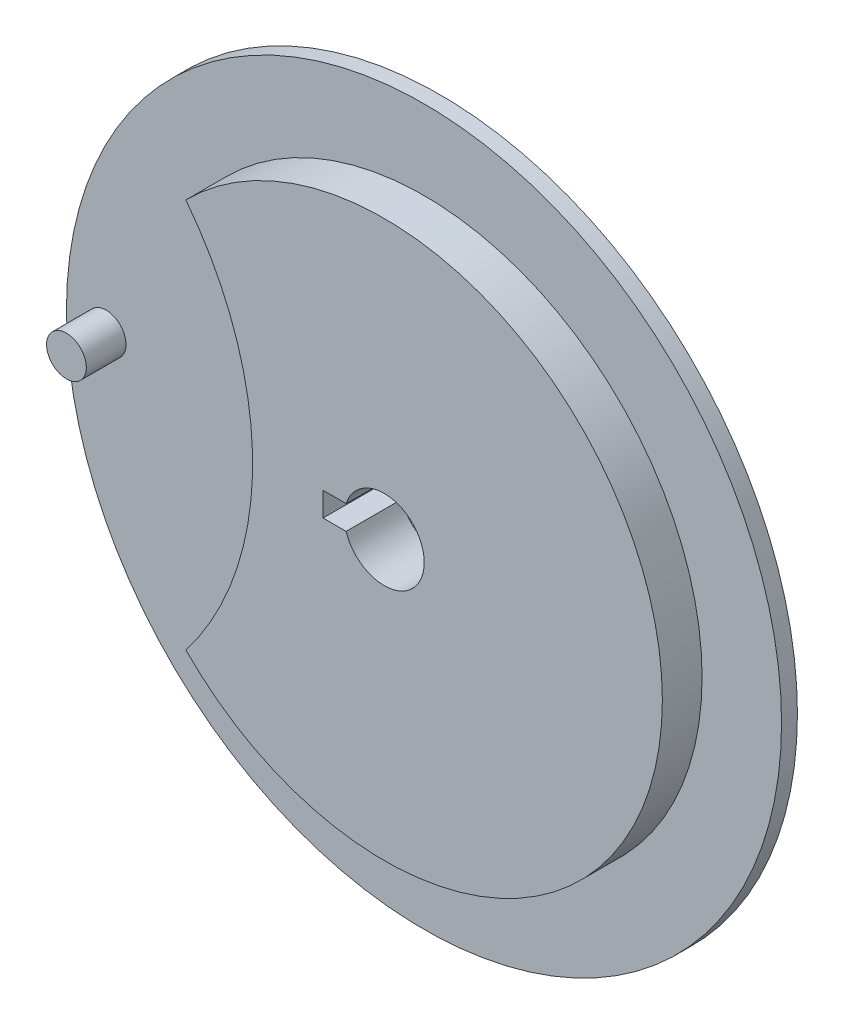
ISO-10303-21;
HEADER;
FILE_DESCRIPTION(('STEP AP214'),'2;1');
FILE_NAME('part.step','',(''),(''),'','','');
FILE_SCHEMA(('AUTOMOTIVE_DESIGN { 1 0 10303 214 1 1 1 1 }'));
ENDSEC;
DATA;
#1=APPLICATION_CONTEXT('core data for automotive mechanical design processes');
#2=APPLICATION_PROTOCOL_DEFINITION('international standard','automotive_design',2000,#1);
#3=PRODUCT_CONTEXT('',#1,'mechanical');
#4=PRODUCT('Part','Part','',(#3));
#5=PRODUCT_RELATED_PRODUCT_CATEGORY('part','',(#4));
#6=PRODUCT_DEFINITION_FORMATION('','',#4);
#7=PRODUCT_DEFINITION_CONTEXT('part definition',#1,'design');
#8=PRODUCT_DEFINITION('design','',#6,#7);
#9=PRODUCT_DEFINITION_SHAPE('','',#8);
#10=(LENGTH_UNIT() NAMED_UNIT(*) SI_UNIT(.MILLI.,.METRE.));
#11=(NAMED_UNIT(*) PLANE_ANGLE_UNIT() SI_UNIT($,.RADIAN.));
#12=(NAMED_UNIT(*) SI_UNIT($,.STERADIAN.) SOLID_ANGLE_UNIT());
#13=UNCERTAINTY_MEASURE_WITH_UNIT(LENGTH_MEASURE(1.E-05),#10,'distance_accuracy_value','');
#14=(GEOMETRIC_REPRESENTATION_CONTEXT(3) GLOBAL_UNCERTAINTY_ASSIGNED_CONTEXT((#13)) GLOBAL_UNIT_ASSIGNED_CONTEXT((#10,
#11,#12)) REPRESENTATION_CONTEXT('',''));
#15=CARTESIAN_POINT('',(0.,0.,0.));
#16=DIRECTION('',(0.,0.,1.));
#17=DIRECTION('',(1.,0.,0.));
#18=AXIS2_PLACEMENT_3D('',#15,#16,#17);
#19=CARTESIAN_POINT('',(-5.00184665318772,0.,-5.80665774050337));
#20=DIRECTION('',(0.,0.,1.));
#21=DIRECTION('',(1.,0.,0.));
#22=AXIS2_PLACEMENT_3D('',#19,#20,#21);
#23=CYLINDRICAL_SURFACE('',#22,89.4375);
#24=CARTESIAN_POINT('',(-5.00184665318772,0.,-5.80665774050337));
#25=DIRECTION('',(0.,0.,1.));
#26=DIRECTION('',(1.,0.,0.));
#27=AXIS2_PLACEMENT_3D('',#24,#25,#26);
#28=CIRCLE('',#27,89.4375);
#29=CARTESIAN_POINT('',(84.4356533468123,0.,-5.80665774050337));
#30=VERTEX_POINT('',#29);
#31=EDGE_CURVE('E170',#30,#30,#28,.T.);
#32=CARTESIAN_POINT('',(-5.00184665318772,0.,-1.83165774050337));
#33=DIRECTION('',(0.,0.,1.));
#34=DIRECTION('',(1.,0.,0.));
#35=AXIS2_PLACEMENT_3D('',#32,#33,#34);
#36=CIRCLE('',#35,89.4375);
#37=CARTESIAN_POINT('',(84.4356533468123,0.,-1.83165774050337));
#38=VERTEX_POINT('',#37);
#39=EDGE_CURVE('E169',#38,#38,#36,.T.);
#40=CARTESIAN_POINT('',(84.4356533468123,0.,-5.80665774050337));
#41=CARTESIAN_POINT('',(84.4356533468123,0.,-5.76525149050337));
#42=CARTESIAN_POINT('',(84.4356533468123,0.,-5.72384524050337));
#43=CARTESIAN_POINT('',(84.4356533468123,0.,-5.64103274050337));
#44=CARTESIAN_POINT('',(84.4356533468123,0.,-5.59962649050337));
#45=CARTESIAN_POINT('',(84.4356533468123,0.,-5.51681399050337));
#46=CARTESIAN_POINT('',(84.4356533468123,0.,-5.47540774050337));
#47=CARTESIAN_POINT('',(84.4356533468123,0.,-5.39259524050337));
#48=CARTESIAN_POINT('',(84.4356533468123,0.,-5.35118899050337));
#49=CARTESIAN_POINT('',(84.4356533468123,0.,-5.26837649050337));
#50=CARTESIAN_POINT('',(84.4356533468123,0.,-5.22697024050337));
#51=CARTESIAN_POINT('',(84.4356533468123,0.,-5.14415774050337));
#52=CARTESIAN_POINT('',(84.4356533468123,0.,-5.10275149050337));
#53=CARTESIAN_POINT('',(84.4356533468123,0.,-5.01993899050337));
#54=CARTESIAN_POINT('',(84.4356533468123,0.,-4.97853274050337));
#55=CARTESIAN_POINT('',(84.4356533468123,0.,-4.89572024050337));
#56=CARTESIAN_POINT('',(84.4356533468123,0.,-4.85431399050337));
#57=CARTESIAN_POINT('',(84.4356533468123,0.,-4.77150149050337));
#58=CARTESIAN_POINT('',(84.4356533468123,0.,-4.73009524050337));
#59=CARTESIAN_POINT('',(84.4356533468123,0.,-4.64728274050337));
#60=CARTESIAN_POINT('',(84.4356533468123,0.,-4.60587649050337));
#61=CARTESIAN_POINT('',(84.4356533468123,0.,-4.52306399050337));
#62=CARTESIAN_POINT('',(84.4356533468123,0.,-4.48165774050337));
#63=CARTESIAN_POINT('',(84.4356533468123,0.,-4.39884524050337));
#64=CARTESIAN_POINT('',(84.4356533468123,0.,-4.35743899050337));
#65=CARTESIAN_POINT('',(84.4356533468123,0.,-4.27462649050337));
#66=CARTESIAN_POINT('',(84.4356533468123,0.,-4.23322024050337));
#67=CARTESIAN_POINT('',(84.4356533468123,0.,-4.15040774050337));
#68=CARTESIAN_POINT('',(84.4356533468123,0.,-4.10900149050337));
#69=CARTESIAN_POINT('',(84.4356533468123,0.,-4.02618899050337));
#70=CARTESIAN_POINT('',(84.4356533468123,0.,-3.98478274050337));
#71=CARTESIAN_POINT('',(84.4356533468123,0.,-3.90197024050337));
#72=CARTESIAN_POINT('',(84.4356533468123,0.,-3.86056399050337));
#73=CARTESIAN_POINT('',(84.4356533468123,0.,-3.77775149050337));
#74=CARTESIAN_POINT('',(84.4356533468123,0.,-3.73634524050337));
#75=CARTESIAN_POINT('',(84.4356533468123,0.,-3.65353274050337));
#76=CARTESIAN_POINT('',(84.4356533468123,0.,-3.61212649050337));
#77=CARTESIAN_POINT('',(84.4356533468123,0.,-3.52931399050337));
#78=CARTESIAN_POINT('',(84.4356533468123,0.,-3.48790774050337));
#79=CARTESIAN_POINT('',(84.4356533468123,0.,-3.40509524050337));
#80=CARTESIAN_POINT('',(84.4356533468123,0.,-3.36368899050337));
#81=CARTESIAN_POINT('',(84.4356533468123,0.,-3.28087649050337));
#82=CARTESIAN_POINT('',(84.4356533468123,0.,-3.23947024050337));
#83=CARTESIAN_POINT('',(84.4356533468123,0.,-3.15665774050337));
#84=CARTESIAN_POINT('',(84.4356533468123,0.,-3.11525149050337));
#85=CARTESIAN_POINT('',(84.4356533468123,0.,-3.03243899050337));
#86=CARTESIAN_POINT('',(84.4356533468123,0.,-2.99103274050337));
#87=CARTESIAN_POINT('',(84.4356533468123,0.,-2.90822024050337));
#88=CARTESIAN_POINT('',(84.4356533468123,0.,-2.86681399050337));
#89=CARTESIAN_POINT('',(84.4356533468123,0.,-2.78400149050337));
#90=CARTESIAN_POINT('',(84.4356533468123,0.,-2.74259524050337));
#91=CARTESIAN_POINT('',(84.4356533468123,0.,-2.65978274050337));
#92=CARTESIAN_POINT('',(84.4356533468123,0.,-2.61837649050337));
#93=CARTESIAN_POINT('',(84.4356533468123,0.,-2.53556399050337));
#94=CARTESIAN_POINT('',(84.4356533468123,0.,-2.49415774050337));
#95=CARTESIAN_POINT('',(84.4356533468123,0.,-2.41134524050337));
#96=CARTESIAN_POINT('',(84.4356533468123,0.,-2.36993899050337));
#97=CARTESIAN_POINT('',(84.4356533468123,0.,-2.28712649050337));
#98=CARTESIAN_POINT('',(84.4356533468123,0.,-2.24572024050337));
#99=CARTESIAN_POINT('',(84.4356533468123,0.,-2.16290774050337));
#100=CARTESIAN_POINT('',(84.4356533468123,0.,-2.12150149050337));
#101=CARTESIAN_POINT('',(84.4356533468123,0.,-2.03868899050337));
#102=CARTESIAN_POINT('',(84.4356533468123,0.,-1.99728274050337));
#103=CARTESIAN_POINT('',(84.4356533468123,0.,-1.91447024050337));
#104=CARTESIAN_POINT('',(84.4356533468123,0.,-1.87306399050337));
#105=CARTESIAN_POINT('',(84.4356533468123,0.,-1.83165774050337));
#106=B_SPLINE_CURVE_WITH_KNOTS('',3,(#40,#41,#42,#43,#44,#45,#46,#47,#48,#49,#50,#51,#52,#53,
#54,#55,#56,#57,#58,#59,#60,#61,#62,#63,#64,#65,#66,#67,#68,#69,#70,#71,#72,#73,#74,#75,#76,#77,
#78,#79,#80,#81,#82,#83,#84,#85,#86,#87,#88,#89,#90,#91,#92,#93,#94,#95,#96,#97,#98,#99,#100,
#101,#102,#103,#104,#105),.UNSPECIFIED.,.F.,.F.,(4,2,2,2,2,2,2,2,2,2,2,2,2,2,2,2,2,2,2,2,2,2,2,
2,2,2,2,2,2,2,2,2,4),(0.,0.124218749999999,0.2484375,0.37265625,0.496875,0.621093749999999,
0.745312499999999,0.86953125,0.99375,1.11796875,1.2421875,1.36640625,1.490625,1.61484375,
1.7390625,1.86328125,1.9875,2.11171875,2.2359375,2.36015625,2.484375,2.60859375,2.7328125,
2.85703125,2.98125,3.10546875,3.2296875,3.35390625,3.478125,3.60234375,3.7265625,3.85078125,
3.975),.UNSPECIFIED.);
#107=EDGE_CURVE('BSEAM44',#30,#38,#106,.T.);
#108=ORIENTED_EDGE('',*,*,#31,.T.);
#109=ORIENTED_EDGE('',*,*,#39,.F.);
#110=ORIENTED_EDGE('',*,*,#107,.T.);
#111=ORIENTED_EDGE('',*,*,#107,.F.);
#112=EDGE_LOOP('',(#108,#110,#109,#111));
#113=FACE_BOUND('',#112,.T.);
#114=ADVANCED_FACE('F44',(#113),#23,.T.);
#115=CARTESIAN_POINT('',(-5.00184665318772,0.,-5.80665774050337));
#116=DIRECTION('',(0.,0.,1.));
#117=DIRECTION('',(1.,0.,0.));
#118=AXIS2_PLACEMENT_3D('',#115,#116,#117);
#119=PLANE('',#118);
#120=CARTESIAN_POINT('',(-5.00184665318772,0.,-5.80665774050337));
#121=DIRECTION('',(0.,0.,1.));
#122=DIRECTION('',(1.,0.,0.));
#123=AXIS2_PLACEMENT_3D('',#120,#121,#122);
#124=CIRCLE('',#123,10.);
#125=CARTESIAN_POINT('',(-14.5412386673572,-3.,-5.80665774050337));
#126=VERTEX_POINT('',#125);
#127=CARTESIAN_POINT('',(-14.5412386673572,3.,-5.80665774050337));
#128=VERTEX_POINT('',#127);
#129=EDGE_CURVE('E138',#126,#128,#124,.T.);
#130=ORIENTED_EDGE('',*,*,#129,.T.);
#131=DIRECTION('',(-1.,0.,0.));
#132=VECTOR('',#131,1.);
#133=CARTESIAN_POINT('',(-5.00184665318772,3.,-5.80665774050337));
#134=LINE('',#133,#132);
#135=CARTESIAN_POINT('',(-20.3018466531877,3.,-5.80665774050337));
#136=VERTEX_POINT('',#135);
#137=EDGE_CURVE('E129',#128,#136,#134,.T.);
#138=ORIENTED_EDGE('',*,*,#137,.T.);
#139=DIRECTION('',(0.,-1.,0.));
#140=VECTOR('',#139,1.);
#141=CARTESIAN_POINT('',(-20.3018466531877,0.,-5.80665774050337));
#142=LINE('',#141,#140);
#143=CARTESIAN_POINT('',(-20.3018466531877,-3.,-5.80665774050337));
#144=VERTEX_POINT('',#143);
#145=EDGE_CURVE('E133',#136,#144,#142,.T.);
#146=ORIENTED_EDGE('',*,*,#145,.T.);
#147=DIRECTION('',(1.,0.,0.));
#148=VECTOR('',#147,1.);
#149=CARTESIAN_POINT('',(-5.00184665318772,-3.,-5.80665774050337));
#150=LINE('',#149,#148);
#151=EDGE_CURVE('E99',#144,#126,#150,.T.);
#152=ORIENTED_EDGE('',*,*,#151,.T.);
#153=EDGE_LOOP('',(#130,#138,#146,#152));
#154=FACE_BOUND('',#153,.T.);
#155=ORIENTED_EDGE('',*,*,#31,.F.);
#156=EDGE_LOOP('',(#155));
#157=FACE_BOUND('',#156,.T.);
#158=ADVANCED_FACE('F181',(#154,#157),#119,.F.);
#159=CARTESIAN_POINT('',(-5.00184665318772,0.,-1.83165774050337));
#160=DIRECTION('',(0.,0.,1.));
#161=DIRECTION('',(1.,0.,0.));
#162=AXIS2_PLACEMENT_3D('',#159,#160,#161);
#163=PLANE('',#162);
#164=CARTESIAN_POINT('',(-84.5018466531877,0.,-1.83165774050337));
#165=DIRECTION('',(0.,0.,1.));
#166=DIRECTION('',(1.,0.,0.));
#167=AXIS2_PLACEMENT_3D('',#164,#165,#166);
#168=CIRCLE('',#167,4.96875000000001);
#169=CARTESIAN_POINT('',(-89.4705966531877,0.,-1.83165774050337));
#170=VERTEX_POINT('',#169);
#171=EDGE_CURVE('E142',#170,#170,#168,.T.);
#172=ORIENTED_EDGE('',*,*,#171,.F.);
#173=EDGE_LOOP('',(#172));
#174=FACE_BOUND('',#173,.T.);
#175=CARTESIAN_POINT('',(-117.431824861849,0.,-1.83165774050337));
#176=DIRECTION('',(0.,0.,1.));
#177=DIRECTION('',(1.,0.,0.));
#178=AXIS2_PLACEMENT_3D('',#175,#176,#177);
#179=CIRCLE('',#178,79.5000000000002);
#180=CARTESIAN_POINT('',(-54.6291417218545,-48.7449791303421,-1.83165774050337));
#181=VERTEX_POINT('',#180);
#182=CARTESIAN_POINT('',(-54.6291417218544,48.7449791303421,-1.83165774050337));
#183=VERTEX_POINT('',#182);
#184=EDGE_CURVE('E67',#181,#183,#179,.T.);
#185=ORIENTED_EDGE('',*,*,#184,.T.);
#186=CARTESIAN_POINT('',(-5.00184665318772,0.,-1.83165774050337));
#187=DIRECTION('',(0.,0.,1.));
#188=DIRECTION('',(1.,0.,0.));
#189=AXIS2_PLACEMENT_3D('',#186,#187,#188);
#190=CIRCLE('',#189,69.5625);
#191=EDGE_CURVE('E155',#181,#183,#190,.T.);
#192=ORIENTED_EDGE('',*,*,#191,.F.);
#193=EDGE_LOOP('',(#185,#192));
#194=FACE_BOUND('',#193,.T.);
#195=ORIENTED_EDGE('',*,*,#39,.T.);
#196=EDGE_LOOP('',(#195));
#197=FACE_BOUND('',#196,.T.);
#198=ADVANCED_FACE('F199',(#174,#194,#197),#163,.T.);
#199=CARTESIAN_POINT('',(-117.431824861849,0.,8.10584225949663));
#200=DIRECTION('',(0.,0.,-1.));
#201=DIRECTION('',(-1.,0.,0.));
#202=AXIS2_PLACEMENT_3D('',#199,#200,#201);
#203=CYLINDRICAL_SURFACE('',#202,79.5000000000002);
#204=ORIENTED_EDGE('',*,*,#184,.F.);
#205=DIRECTION('',(0.,0.,-1.));
#206=VECTOR('',#205,1.);
#207=CARTESIAN_POINT('',(-54.6291417218545,-48.7449791303421,8.10584225949663));
#208=LINE('',#207,#206);
#209=CARTESIAN_POINT('',(-54.6291417218545,-48.7449791303421,8.10584225949663));
#210=VERTEX_POINT('',#209);
#211=EDGE_CURVE('E166',#210,#181,#208,.T.);
#212=ORIENTED_EDGE('',*,*,#211,.F.);
#213=CARTESIAN_POINT('',(-117.431824861849,0.,8.10584225949663));
#214=DIRECTION('',(0.,0.,1.));
#215=DIRECTION('',(1.,0.,0.));
#216=AXIS2_PLACEMENT_3D('',#213,#214,#215);
#217=CIRCLE('',#216,79.5000000000002);
#218=CARTESIAN_POINT('',(-54.6291417218544,48.7449791303421,8.10584225949663));
#219=VERTEX_POINT('',#218);
#220=EDGE_CURVE('E150',#210,#219,#217,.T.);
#221=ORIENTED_EDGE('',*,*,#220,.T.);
#222=DIRECTION('',(0.,0.,-1.));
#223=VECTOR('',#222,1.);
#224=CARTESIAN_POINT('',(-54.6291417218544,48.7449791303421,8.10584225949663));
#225=LINE('',#224,#223);
#226=EDGE_CURVE('E158',#219,#183,#225,.T.);
#227=ORIENTED_EDGE('',*,*,#226,.T.);
#228=EDGE_LOOP('',(#204,#212,#221,#227));
#229=FACE_BOUND('',#228,.T.);
#230=ADVANCED_FACE('F206',(#229),#203,.F.);
#231=CARTESIAN_POINT('',(-5.00184665318772,0.,8.10584225949663));
#232=DIRECTION('',(0.,0.,-1.));
#233=DIRECTION('',(-1.,0.,0.));
#234=AXIS2_PLACEMENT_3D('',#231,#232,#233);
#235=CYLINDRICAL_SURFACE('',#234,69.5625);
#236=ORIENTED_EDGE('',*,*,#191,.T.);
#237=ORIENTED_EDGE('',*,*,#226,.F.);
#238=CARTESIAN_POINT('',(-5.00184665318772,0.,8.10584225949663));
#239=DIRECTION('',(0.,0.,1.));
#240=DIRECTION('',(1.,0.,0.));
#241=AXIS2_PLACEMENT_3D('',#238,#239,#240);
#242=CIRCLE('',#241,69.5625);
#243=EDGE_CURVE('E154',#210,#219,#242,.T.);
#244=ORIENTED_EDGE('',*,*,#243,.F.);
#245=ORIENTED_EDGE('',*,*,#211,.T.);
#246=EDGE_LOOP('',(#236,#237,#244,#245));
#247=FACE_BOUND('',#246,.T.);
#248=ADVANCED_FACE('F211',(#247),#235,.T.);
#249=CARTESIAN_POINT('',(-5.00184665318772,0.,8.10584225949663));
#250=DIRECTION('',(0.,0.,1.));
#251=DIRECTION('',(1.,0.,0.));
#252=AXIS2_PLACEMENT_3D('',#249,#250,#251);
#253=PLANE('',#252);
#254=DIRECTION('',(-1.,0.,0.));
#255=VECTOR('',#254,1.);
#256=CARTESIAN_POINT('',(-9.70184665318772,3.,8.10584225949663));
#257=LINE('',#256,#255);
#258=CARTESIAN_POINT('',(-14.5412386673572,3.,8.10584225949663));
#259=VERTEX_POINT('',#258);
#260=CARTESIAN_POINT('',(-20.3018466531877,3.,8.10584225949663));
#261=VERTEX_POINT('',#260);
#262=EDGE_CURVE('E104',#259,#261,#257,.T.);
#263=ORIENTED_EDGE('',*,*,#262,.F.);
#264=CARTESIAN_POINT('',(-5.00184665318772,0.,8.10584225949663));
#265=DIRECTION('',(0.,0.,1.));
#266=DIRECTION('',(1.,0.,0.));
#267=AXIS2_PLACEMENT_3D('',#264,#265,#266);
#268=CIRCLE('',#267,10.);
#269=CARTESIAN_POINT('',(-14.5412386673572,-3.,8.10584225949663));
#270=VERTEX_POINT('',#269);
#271=EDGE_CURVE('E119',#270,#259,#268,.T.);
#272=ORIENTED_EDGE('',*,*,#271,.F.);
#273=DIRECTION('',(1.,0.,0.));
#274=VECTOR('',#273,1.);
#275=CARTESIAN_POINT('',(-9.70184665318772,-3.,8.10584225949663));
#276=LINE('',#275,#274);
#277=CARTESIAN_POINT('',(-20.3018466531877,-3.,8.10584225949663));
#278=VERTEX_POINT('',#277);
#279=EDGE_CURVE('E59',#278,#270,#276,.T.);
#280=ORIENTED_EDGE('',*,*,#279,.F.);
#281=DIRECTION('',(0.,-1.,0.));
#282=VECTOR('',#281,1.);
#283=CARTESIAN_POINT('',(-20.3018466531877,-3.,8.10584225949663));
#284=LINE('',#283,#282);
#285=EDGE_CURVE('E107',#261,#278,#284,.T.);
#286=ORIENTED_EDGE('',*,*,#285,.F.);
#287=EDGE_LOOP('',(#263,#272,#280,#286));
#288=FACE_BOUND('',#287,.T.);
#289=ORIENTED_EDGE('',*,*,#220,.F.);
#290=ORIENTED_EDGE('',*,*,#243,.T.);
#291=EDGE_LOOP('',(#289,#290));
#292=FACE_BOUND('',#291,.T.);
#293=ADVANCED_FACE('F116',(#288,#292),#253,.T.);
#294=CARTESIAN_POINT('',(-84.5018466531877,0.,8.10584225949663));
#295=DIRECTION('',(0.,0.,-1.));
#296=DIRECTION('',(-1.,0.,0.));
#297=AXIS2_PLACEMENT_3D('',#294,#295,#296);
#298=CYLINDRICAL_SURFACE('',#297,4.96875000000001);
#299=CARTESIAN_POINT('',(-84.5018466531877,0.,8.10584225949663));
#300=DIRECTION('',(0.,0.,1.));
#301=DIRECTION('',(1.,0.,0.));
#302=AXIS2_PLACEMENT_3D('',#299,#300,#301);
#303=CIRCLE('',#302,4.96875000000001);
#304=CARTESIAN_POINT('',(-89.4705966531877,0.,8.10584225949663));
#305=VERTEX_POINT('',#304);
#306=EDGE_CURVE('E143',#305,#305,#303,.T.);
#307=CARTESIAN_POINT('',(-89.4705966531877,0.,8.10584225949663));
#308=CARTESIAN_POINT('',(-89.4705966531877,0.,8.00232663449663));
#309=CARTESIAN_POINT('',(-89.4705966531877,0.,7.89881100949663));
#310=CARTESIAN_POINT('',(-89.4705966531877,0.,7.69177975949663));
#311=CARTESIAN_POINT('',(-89.4705966531877,0.,7.58826413449663));
#312=CARTESIAN_POINT('',(-89.4705966531877,0.,7.38123288449663));
#313=CARTESIAN_POINT('',(-89.4705966531877,0.,7.27771725949663));
#314=CARTESIAN_POINT('',(-89.4705966531877,0.,7.07068600949663));
#315=CARTESIAN_POINT('',(-89.4705966531877,0.,6.96717038449663));
#316=CARTESIAN_POINT('',(-89.4705966531877,0.,6.76013913449663));
#317=CARTESIAN_POINT('',(-89.4705966531877,0.,6.65662350949663));
#318=CARTESIAN_POINT('',(-89.4705966531877,0.,6.44959225949663));
#319=CARTESIAN_POINT('',(-89.4705966531877,0.,6.34607663449663));
#320=CARTESIAN_POINT('',(-89.4705966531877,0.,6.13904538449663));
#321=CARTESIAN_POINT('',(-89.4705966531877,0.,6.03552975949663));
#322=CARTESIAN_POINT('',(-89.4705966531877,0.,5.82849850949663));
#323=CARTESIAN_POINT('',(-89.4705966531877,0.,5.72498288449663));
#324=CARTESIAN_POINT('',(-89.4705966531877,0.,5.51795163449663));
#325=CARTESIAN_POINT('',(-89.4705966531877,0.,5.41443600949663));
#326=CARTESIAN_POINT('',(-89.4705966531877,0.,5.20740475949663));
#327=CARTESIAN_POINT('',(-89.4705966531877,0.,5.10388913449663));
#328=CARTESIAN_POINT('',(-89.4705966531877,0.,4.89685788449663));
#329=CARTESIAN_POINT('',(-89.4705966531877,0.,4.79334225949663));
#330=CARTESIAN_POINT('',(-89.4705966531877,0.,4.58631100949663));
#331=CARTESIAN_POINT('',(-89.4705966531877,0.,4.48279538449663));
#332=CARTESIAN_POINT('',(-89.4705966531877,0.,4.27576413449663));
#333=CARTESIAN_POINT('',(-89.4705966531877,0.,4.17224850949663));
#334=CARTESIAN_POINT('',(-89.4705966531877,0.,3.96521725949663));
#335=CARTESIAN_POINT('',(-89.4705966531877,0.,3.86170163449663));
#336=CARTESIAN_POINT('',(-89.4705966531877,0.,3.65467038449663));
#337=CARTESIAN_POINT('',(-89.4705966531877,0.,3.55115475949663));
#338=CARTESIAN_POINT('',(-89.4705966531877,0.,3.34412350949663));
#339=CARTESIAN_POINT('',(-89.4705966531877,0.,3.24060788449663));
#340=CARTESIAN_POINT('',(-89.4705966531877,0.,3.03357663449663));
#341=CARTESIAN_POINT('',(-89.4705966531877,0.,2.93006100949663));
#342=CARTESIAN_POINT('',(-89.4705966531877,0.,2.72302975949663));
#343=CARTESIAN_POINT('',(-89.4705966531877,0.,2.61951413449663));
#344=CARTESIAN_POINT('',(-89.4705966531877,0.,2.41248288449663));
#345=CARTESIAN_POINT('',(-89.4705966531877,0.,2.30896725949663));
#346=CARTESIAN_POINT('',(-89.4705966531877,0.,2.10193600949663));
#347=CARTESIAN_POINT('',(-89.4705966531877,0.,1.99842038449663));
#348=CARTESIAN_POINT('',(-89.4705966531877,0.,1.79138913449663));
#349=CARTESIAN_POINT('',(-89.4705966531877,0.,1.68787350949663));
#350=CARTESIAN_POINT('',(-89.4705966531877,0.,1.48084225949663));
#351=CARTESIAN_POINT('',(-89.4705966531877,0.,1.37732663449663));
#352=CARTESIAN_POINT('',(-89.4705966531877,0.,1.17029538449663));
#353=CARTESIAN_POINT('',(-89.4705966531877,0.,1.06677975949663));
#354=CARTESIAN_POINT('',(-89.4705966531877,0.,0.859748509496628));
#355=CARTESIAN_POINT('',(-89.4705966531877,0.,0.756232884496628));
#356=CARTESIAN_POINT('',(-89.4705966531877,0.,0.549201634496628));
#357=CARTESIAN_POINT('',(-89.4705966531877,0.,0.445686009496628));
#358=CARTESIAN_POINT('',(-89.4705966531877,0.,0.238654759496629));
#359=CARTESIAN_POINT('',(-89.4705966531877,0.,0.13513913449663));
#360=CARTESIAN_POINT('',(-89.4705966531877,0.,-0.0718921155033701));
#361=CARTESIAN_POINT('',(-89.4705966531877,0.,-0.175407740503371));
#362=CARTESIAN_POINT('',(-89.4705966531877,0.,-0.382438990503371));
#363=CARTESIAN_POINT('',(-89.4705966531877,0.,-0.485954615503371));
#364=CARTESIAN_POINT('',(-89.4705966531877,0.,-0.69298586550337));
#365=CARTESIAN_POINT('',(-89.4705966531877,0.,-0.79650149050337));
#366=CARTESIAN_POINT('',(-89.4705966531877,0.,-1.00353274050337));
#367=CARTESIAN_POINT('',(-89.4705966531877,0.,-1.10704836550337));
#368=CARTESIAN_POINT('',(-89.4705966531877,0.,-1.31407961550337));
#369=CARTESIAN_POINT('',(-89.4705966531877,0.,-1.41759524050337));
#370=CARTESIAN_POINT('',(-89.4705966531877,0.,-1.62462649050337));
#371=CARTESIAN_POINT('',(-89.4705966531877,0.,-1.72814211550337));
#372=CARTESIAN_POINT('',(-89.4705966531877,0.,-1.83165774050337));
#373=B_SPLINE_CURVE_WITH_KNOTS('',3,(#307,#308,#309,#310,#311,#312,#313,#314,#315,#316,#317,
#318,#319,#320,#321,#322,#323,#324,#325,#326,#327,#328,#329,#330,#331,#332,#333,#334,#335,#336,
#337,#338,#339,#340,#341,#342,#343,#344,#345,#346,#347,#348,#349,#350,#351,#352,#353,#354,#355,
#356,#357,#358,#359,#360,#361,#362,#363,#364,#365,#366,#367,#368,#369,#370,#371,#372),
.UNSPECIFIED.,.F.,.F.,(4,2,2,2,2,2,2,2,2,2,2,2,2,2,2,2,2,2,2,2,2,2,2,2,2,2,2,2,2,2,2,2,4),(0.,
0.310546875,0.621093750000001,0.931640625000001,1.2421875,1.552734375,1.86328125,2.173828125,
2.484375,2.794921875,3.10546875,3.416015625,3.7265625,4.037109375,4.34765625,4.658203125,
4.96875,5.279296875,5.58984375,5.900390625,6.2109375,6.521484375,6.83203125,7.142578125,
7.453125,7.763671875,8.07421875,8.384765625,8.6953125,9.005859375,9.31640625,9.626953125,
9.9375),.UNSPECIFIED.);
#374=EDGE_CURVE('BSEAM221',#305,#170,#373,.T.);
#375=ORIENTED_EDGE('',*,*,#306,.F.);
#376=ORIENTED_EDGE('',*,*,#171,.T.);
#377=ORIENTED_EDGE('',*,*,#374,.T.);
#378=ORIENTED_EDGE('',*,*,#374,.F.);
#379=EDGE_LOOP('',(#375,#377,#376,#378));
#380=FACE_BOUND('',#379,.T.);
#381=ADVANCED_FACE('F221',(#380),#298,.T.);
#382=CARTESIAN_POINT('',(-5.00184665318772,0.,8.10584225949663));
#383=DIRECTION('',(0.,0.,1.));
#384=DIRECTION('',(1.,0.,0.));
#385=AXIS2_PLACEMENT_3D('',#382,#383,#384);
#386=PLANE('',#385);
#387=ORIENTED_EDGE('',*,*,#306,.T.);
#388=EDGE_LOOP('',(#387));
#389=FACE_BOUND('',#388,.T.);
#390=ADVANCED_FACE('F224',(#389),#386,.T.);
#391=CARTESIAN_POINT('',(-5.00184665318772,0.,-14.8941577405034));
#392=DIRECTION('',(0.,0.,1.));
#393=DIRECTION('',(1.,0.,0.));
#394=AXIS2_PLACEMENT_3D('',#391,#392,#393);
#395=CYLINDRICAL_SURFACE('',#394,10.);
#396=ORIENTED_EDGE('',*,*,#271,.T.);
#397=DIRECTION('',(0.,0.,1.));
#398=VECTOR('',#397,1.);
#399=CARTESIAN_POINT('',(-14.5412386673572,3.,-14.8941577405034));
#400=LINE('',#399,#398);
#401=EDGE_CURVE('E11',#259,#128,#400,.F.);
#402=ORIENTED_EDGE('',*,*,#401,.T.);
#403=ORIENTED_EDGE('',*,*,#129,.F.);
#404=DIRECTION('',(0.,0.,1.));
#405=VECTOR('',#404,1.);
#406=CARTESIAN_POINT('',(-14.5412386673572,-3.,-14.8941577405034));
#407=LINE('',#406,#405);
#408=EDGE_CURVE('E52',#126,#270,#407,.T.);
#409=ORIENTED_EDGE('',*,*,#408,.T.);
#410=EDGE_LOOP('',(#396,#402,#403,#409));
#411=FACE_BOUND('',#410,.T.);
#412=ADVANCED_FACE('F179',(#411),#395,.F.);
#413=CARTESIAN_POINT('',(-20.3018466531877,-3.,-31.8941577405034));
#414=DIRECTION('',(-1.,0.,0.));
#415=DIRECTION('',(0.,0.,1.));
#416=AXIS2_PLACEMENT_3D('',#413,#414,#415);
#417=PLANE('',#416);
#418=DIRECTION('',(0.,0.,1.));
#419=VECTOR('',#418,1.);
#420=CARTESIAN_POINT('',(-20.3018466531877,3.,-31.8941577405034));
#421=LINE('',#420,#419);
#422=EDGE_CURVE('E103',#136,#261,#421,.T.);
#423=ORIENTED_EDGE('',*,*,#422,.T.);
#424=ORIENTED_EDGE('',*,*,#285,.T.);
#425=DIRECTION('',(0.,0.,1.));
#426=VECTOR('',#425,1.);
#427=CARTESIAN_POINT('',(-20.3018466531877,-3.,-31.8941577405034));
#428=LINE('',#427,#426);
#429=EDGE_CURVE('E95',#144,#278,#428,.T.);
#430=ORIENTED_EDGE('',*,*,#429,.F.);
#431=ORIENTED_EDGE('',*,*,#145,.F.);
#432=EDGE_LOOP('',(#423,#424,#430,#431));
#433=FACE_BOUND('',#432,.T.);
#434=ADVANCED_FACE('F108',(#433),#417,.F.);
#435=CARTESIAN_POINT('',(-9.70184665318772,3.,-31.8941577405034));
#436=DIRECTION('',(0.,1.,0.));
#437=DIRECTION('',(-1.,0.,0.));
#438=AXIS2_PLACEMENT_3D('',#435,#436,#437);
#439=PLANE('',#438);
#440=ORIENTED_EDGE('',*,*,#401,.F.);
#441=ORIENTED_EDGE('',*,*,#262,.T.);
#442=ORIENTED_EDGE('',*,*,#422,.F.);
#443=ORIENTED_EDGE('',*,*,#137,.F.);
#444=EDGE_LOOP('',(#440,#441,#442,#443));
#445=FACE_BOUND('',#444,.T.);
#446=ADVANCED_FACE('F184',(#445),#439,.F.);
#447=CARTESIAN_POINT('',(-9.70184665318772,-3.,-31.8941577405034));
#448=DIRECTION('',(0.,-1.,0.));
#449=DIRECTION('',(1.,0.,0.));
#450=AXIS2_PLACEMENT_3D('',#447,#448,#449);
#451=PLANE('',#450);
#452=ORIENTED_EDGE('',*,*,#429,.T.);
#453=ORIENTED_EDGE('',*,*,#279,.T.);
#454=ORIENTED_EDGE('',*,*,#408,.F.);
#455=ORIENTED_EDGE('',*,*,#151,.F.);
#456=EDGE_LOOP('',(#452,#453,#454,#455));
#457=FACE_BOUND('',#456,.T.);
#458=ADVANCED_FACE('F97',(#457),#451,.F.);
#459=CLOSED_SHELL('',(#114,#158,#198,#230,#248,#293,#381,#390,#412,#434,#446,#458));
#460=MANIFOLD_SOLID_BREP('B2',#459);
#461=ADVANCED_BREP_SHAPE_REPRESENTATION('',(#18,#460),#14);
#462=SHAPE_DEFINITION_REPRESENTATION(#9,#461);
ENDSEC;
END-ISO-10303-21;
